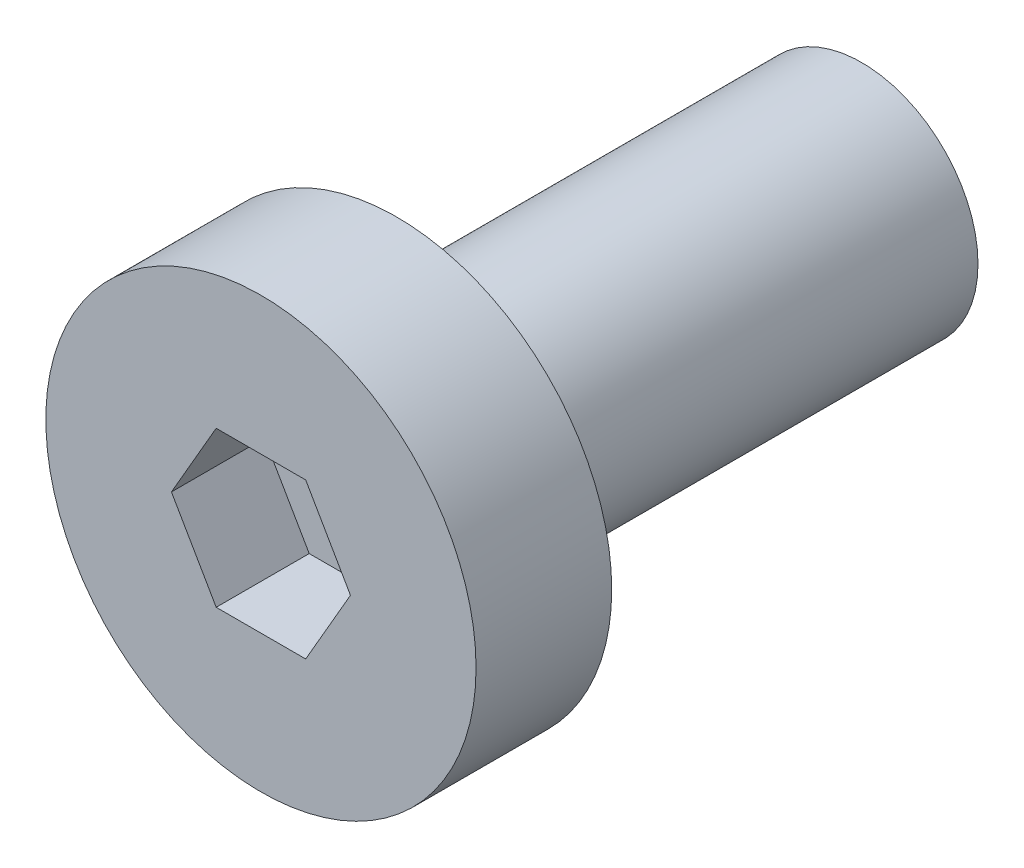
ISO-10303-21;
HEADER;
FILE_DESCRIPTION(('STEP AP214'),'2;1');
FILE_NAME('part.step','',(''),(''),'','','');
FILE_SCHEMA(('AUTOMOTIVE_DESIGN { 1 0 10303 214 1 1 1 1 }'));
ENDSEC;
DATA;
#1=APPLICATION_CONTEXT('core data for automotive mechanical design processes');
#2=APPLICATION_PROTOCOL_DEFINITION('international standard','automotive_design',2000,#1);
#3=PRODUCT_CONTEXT('',#1,'mechanical');
#4=PRODUCT('Part','Part','',(#3));
#5=PRODUCT_RELATED_PRODUCT_CATEGORY('part','',(#4));
#6=PRODUCT_DEFINITION_FORMATION('','',#4);
#7=PRODUCT_DEFINITION_CONTEXT('part definition',#1,'design');
#8=PRODUCT_DEFINITION('design','',#6,#7);
#9=PRODUCT_DEFINITION_SHAPE('','',#8);
#10=(LENGTH_UNIT() NAMED_UNIT(*) SI_UNIT(.MILLI.,.METRE.));
#11=(NAMED_UNIT(*) PLANE_ANGLE_UNIT() SI_UNIT($,.RADIAN.));
#12=(NAMED_UNIT(*) SI_UNIT($,.STERADIAN.) SOLID_ANGLE_UNIT());
#13=UNCERTAINTY_MEASURE_WITH_UNIT(LENGTH_MEASURE(1.E-05),#10,'distance_accuracy_value','');
#14=(GEOMETRIC_REPRESENTATION_CONTEXT(3) GLOBAL_UNCERTAINTY_ASSIGNED_CONTEXT((#13)) GLOBAL_UNIT_ASSIGNED_CONTEXT((#10,
#11,#12)) REPRESENTATION_CONTEXT('',''));
#15=CARTESIAN_POINT('',(0.,0.,0.));
#16=DIRECTION('',(0.,0.,1.));
#17=DIRECTION('',(1.,0.,0.));
#18=AXIS2_PLACEMENT_3D('',#15,#16,#17);
#19=CARTESIAN_POINT('',(0.,0.,1.75));
#20=DIRECTION('',(0.,0.,-1.));
#21=DIRECTION('',(-1.,0.,0.));
#22=AXIS2_PLACEMENT_3D('',#19,#20,#21);
#23=CYLINDRICAL_SURFACE('',#22,2.775);
#24=CARTESIAN_POINT('',(0.,0.,1.75));
#25=DIRECTION('',(0.,0.,1.));
#26=DIRECTION('',(1.,0.,0.));
#27=AXIS2_PLACEMENT_3D('',#24,#25,#26);
#28=CIRCLE('',#27,2.775);
#29=CARTESIAN_POINT('',(2.775,0.,1.75));
#30=VERTEX_POINT('',#29);
#31=EDGE_CURVE('E48',#30,#30,#28,.T.);
#32=ORIENTED_EDGE('',*,*,#31,.F.);
#33=EDGE_LOOP('',(#32));
#34=FACE_BOUND('',#33,.T.);
#35=CARTESIAN_POINT('',(0.,0.,0.));
#36=DIRECTION('',(0.,0.,1.));
#37=DIRECTION('',(1.,0.,0.));
#38=AXIS2_PLACEMENT_3D('',#35,#36,#37);
#39=CIRCLE('',#38,2.775);
#40=CARTESIAN_POINT('',(2.775,0.,0.));
#41=VERTEX_POINT('',#40);
#42=EDGE_CURVE('E42',#41,#41,#39,.T.);
#43=ORIENTED_EDGE('',*,*,#42,.T.);
#44=EDGE_LOOP('',(#43));
#45=FACE_BOUND('',#44,.T.);
#46=ADVANCED_FACE('F39',(#34,#45),#23,.T.);
#47=CARTESIAN_POINT('',(0.,0.,1.75));
#48=DIRECTION('',(0.,0.,1.));
#49=DIRECTION('',(1.,0.,0.));
#50=AXIS2_PLACEMENT_3D('',#47,#48,#49);
#51=PLANE('',#50);
#52=DIRECTION('',(0.5,0.866025403784439,0.));
#53=VECTOR('',#52,1.);
#54=CARTESIAN_POINT('',(0.577350269189626,-1.,1.75));
#55=LINE('',#54,#53);
#56=CARTESIAN_POINT('',(0.577350269189626,-1.,1.75));
#57=VERTEX_POINT('',#56);
#58=CARTESIAN_POINT('',(1.15470053837925,0.,1.75));
#59=VERTEX_POINT('',#58);
#60=EDGE_CURVE('E59',#57,#59,#55,.T.);
#61=ORIENTED_EDGE('',*,*,#60,.F.);
#62=DIRECTION('',(1.,0.,0.));
#63=VECTOR('',#62,1.);
#64=CARTESIAN_POINT('',(-0.577350269189626,-1.,1.75));
#65=LINE('',#64,#63);
#66=CARTESIAN_POINT('',(-0.577350269189626,-1.,1.75));
#67=VERTEX_POINT('',#66);
#68=EDGE_CURVE('E162',#67,#57,#65,.T.);
#69=ORIENTED_EDGE('',*,*,#68,.F.);
#70=DIRECTION('',(0.5,-0.866025403784439,0.));
#71=VECTOR('',#70,1.);
#72=CARTESIAN_POINT('',(-1.15470053837925,0.,1.75));
#73=LINE('',#72,#71);
#74=CARTESIAN_POINT('',(-1.15470053837925,0.,1.75));
#75=VERTEX_POINT('',#74);
#76=EDGE_CURVE('E159',#75,#67,#73,.T.);
#77=ORIENTED_EDGE('',*,*,#76,.F.);
#78=DIRECTION('',(-0.5,-0.866025403784439,0.));
#79=VECTOR('',#78,1.);
#80=CARTESIAN_POINT('',(-0.577350269189626,1.,1.75));
#81=LINE('',#80,#79);
#82=CARTESIAN_POINT('',(-0.577350269189626,1.,1.75));
#83=VERTEX_POINT('',#82);
#84=EDGE_CURVE('E116',#83,#75,#81,.T.);
#85=ORIENTED_EDGE('',*,*,#84,.F.);
#86=DIRECTION('',(-1.,0.,0.));
#87=VECTOR('',#86,1.);
#88=CARTESIAN_POINT('',(0.577350269189626,1.,1.75));
#89=LINE('',#88,#87);
#90=CARTESIAN_POINT('',(0.577350269189626,1.,1.75));
#91=VERTEX_POINT('',#90);
#92=EDGE_CURVE('E153',#91,#83,#89,.T.);
#93=ORIENTED_EDGE('',*,*,#92,.F.);
#94=DIRECTION('',(-0.5,0.866025403784438,0.));
#95=VECTOR('',#94,1.);
#96=CARTESIAN_POINT('',(1.15470053837925,0.,1.75));
#97=LINE('',#96,#95);
#98=EDGE_CURVE('E149',#59,#91,#97,.T.);
#99=ORIENTED_EDGE('',*,*,#98,.F.);
#100=EDGE_LOOP('',(#61,#69,#77,#85,#93,#99));
#101=FACE_BOUND('',#100,.T.);
#102=ORIENTED_EDGE('',*,*,#31,.T.);
#103=EDGE_LOOP('',(#102));
#104=FACE_BOUND('',#103,.T.);
#105=ADVANCED_FACE('F191',(#101,#104),#51,.T.);
#106=CARTESIAN_POINT('',(0.,0.,0.));
#107=DIRECTION('',(0.,0.,1.));
#108=DIRECTION('',(1.,0.,0.));
#109=AXIS2_PLACEMENT_3D('',#106,#107,#108);
#110=PLANE('',#109);
#111=CARTESIAN_POINT('',(0.,0.,0.));
#112=DIRECTION('',(0.,0.,-1.));
#113=DIRECTION('',(-1.,0.,0.));
#114=AXIS2_PLACEMENT_3D('',#111,#112,#113);
#115=CIRCLE('',#114,1.5);
#116=CARTESIAN_POINT('',(-1.5,0.,0.));
#117=VERTEX_POINT('',#116);
#118=EDGE_CURVE('E11',#117,#117,#115,.T.);
#119=ORIENTED_EDGE('',*,*,#118,.F.);
#120=EDGE_LOOP('',(#119));
#121=FACE_BOUND('',#120,.T.);
#122=ORIENTED_EDGE('',*,*,#42,.F.);
#123=EDGE_LOOP('',(#122));
#124=FACE_BOUND('',#123,.T.);
#125=ADVANCED_FACE('F188',(#121,#124),#110,.F.);
#126=CARTESIAN_POINT('',(0.,0.,-6.));
#127=DIRECTION('',(0.,0.,1.));
#128=DIRECTION('',(1.,0.,0.));
#129=AXIS2_PLACEMENT_3D('',#126,#127,#128);
#130=CYLINDRICAL_SURFACE('',#129,1.5);
#131=CARTESIAN_POINT('',(0.,0.,-6.));
#132=DIRECTION('',(0.,0.,-1.));
#133=DIRECTION('',(-1.,0.,0.));
#134=AXIS2_PLACEMENT_3D('',#131,#132,#133);
#135=CIRCLE('',#134,1.5);
#136=CARTESIAN_POINT('',(-1.5,0.,-6.));
#137=VERTEX_POINT('',#136);
#138=EDGE_CURVE('E168',#137,#137,#135,.T.);
#139=ORIENTED_EDGE('',*,*,#138,.F.);
#140=EDGE_LOOP('',(#139));
#141=FACE_BOUND('',#140,.T.);
#142=ORIENTED_EDGE('',*,*,#118,.T.);
#143=EDGE_LOOP('',(#142));
#144=FACE_BOUND('',#143,.T.);
#145=ADVANCED_FACE('F190',(#141,#144),#130,.T.);
#146=CARTESIAN_POINT('',(0.,0.,-6.));
#147=DIRECTION('',(0.,0.,-1.));
#148=DIRECTION('',(-1.,0.,0.));
#149=AXIS2_PLACEMENT_3D('',#146,#147,#148);
#150=PLANE('',#149);
#151=ORIENTED_EDGE('',*,*,#138,.T.);
#152=EDGE_LOOP('',(#151));
#153=FACE_BOUND('',#152,.T.);
#154=ADVANCED_FACE('F197',(#153),#150,.T.);
#155=CARTESIAN_POINT('',(0.577350269189626,-1.,0.55));
#156=DIRECTION('',(0.866025403784439,-0.5,0.));
#157=DIRECTION('',(0.5,0.866025403784439,0.));
#158=AXIS2_PLACEMENT_3D('',#155,#156,#157);
#159=PLANE('',#158);
#160=ORIENTED_EDGE('',*,*,#60,.T.);
#161=DIRECTION('',(0.,0.,1.));
#162=VECTOR('',#161,1.);
#163=CARTESIAN_POINT('',(1.15470053837925,0.,0.55));
#164=LINE('',#163,#162);
#165=CARTESIAN_POINT('',(1.15470053837925,0.,0.55));
#166=VERTEX_POINT('',#165);
#167=EDGE_CURVE('E97',#166,#59,#164,.T.);
#168=ORIENTED_EDGE('',*,*,#167,.F.);
#169=DIRECTION('',(0.5,0.866025403784439,0.));
#170=VECTOR('',#169,1.);
#171=CARTESIAN_POINT('',(0.577350269189626,-1.,0.55));
#172=LINE('',#171,#170);
#173=CARTESIAN_POINT('',(0.577350269189626,-1.,0.55));
#174=VERTEX_POINT('',#173);
#175=EDGE_CURVE('E165',#174,#166,#172,.T.);
#176=ORIENTED_EDGE('',*,*,#175,.F.);
#177=DIRECTION('',(0.,0.,1.));
#178=VECTOR('',#177,1.);
#179=CARTESIAN_POINT('',(0.577350269189626,-1.,0.55));
#180=LINE('',#179,#178);
#181=EDGE_CURVE('E70',#174,#57,#180,.T.);
#182=ORIENTED_EDGE('',*,*,#181,.T.);
#183=EDGE_LOOP('',(#160,#168,#176,#182));
#184=FACE_BOUND('',#183,.T.);
#185=ADVANCED_FACE('F230',(#184),#159,.F.);
#186=CARTESIAN_POINT('',(-0.577350269189626,-1.,0.55));
#187=DIRECTION('',(0.,-1.,0.));
#188=DIRECTION('',(0.,0.,-1.));
#189=AXIS2_PLACEMENT_3D('',#186,#187,#188);
#190=PLANE('',#189);
#191=ORIENTED_EDGE('',*,*,#68,.T.);
#192=ORIENTED_EDGE('',*,*,#181,.F.);
#193=DIRECTION('',(1.,0.,0.));
#194=VECTOR('',#193,1.);
#195=CARTESIAN_POINT('',(-0.577350269189626,-1.,0.55));
#196=LINE('',#195,#194);
#197=CARTESIAN_POINT('',(-0.577350269189626,-1.,0.55));
#198=VERTEX_POINT('',#197);
#199=EDGE_CURVE('E130',#198,#174,#196,.T.);
#200=ORIENTED_EDGE('',*,*,#199,.F.);
#201=DIRECTION('',(0.,0.,1.));
#202=VECTOR('',#201,1.);
#203=CARTESIAN_POINT('',(-0.577350269189626,-1.,0.55));
#204=LINE('',#203,#202);
#205=EDGE_CURVE('E121',#198,#67,#204,.T.);
#206=ORIENTED_EDGE('',*,*,#205,.T.);
#207=EDGE_LOOP('',(#191,#192,#200,#206));
#208=FACE_BOUND('',#207,.T.);
#209=ADVANCED_FACE('F240',(#208),#190,.F.);
#210=CARTESIAN_POINT('',(-1.15470053837925,0.,0.55));
#211=DIRECTION('',(-0.866025403784439,-0.5,0.));
#212=DIRECTION('',(0.5,-0.866025403784439,0.));
#213=AXIS2_PLACEMENT_3D('',#210,#211,#212);
#214=PLANE('',#213);
#215=ORIENTED_EDGE('',*,*,#76,.T.);
#216=ORIENTED_EDGE('',*,*,#205,.F.);
#217=DIRECTION('',(0.5,-0.866025403784439,0.));
#218=VECTOR('',#217,1.);
#219=CARTESIAN_POINT('',(-1.15470053837925,0.,0.55));
#220=LINE('',#219,#218);
#221=CARTESIAN_POINT('',(-1.15470053837925,0.,0.55));
#222=VERTEX_POINT('',#221);
#223=EDGE_CURVE('E125',#222,#198,#220,.T.);
#224=ORIENTED_EDGE('',*,*,#223,.F.);
#225=DIRECTION('',(0.,0.,1.));
#226=VECTOR('',#225,1.);
#227=CARTESIAN_POINT('',(-1.15470053837925,0.,0.55));
#228=LINE('',#227,#226);
#229=EDGE_CURVE('E109',#222,#75,#228,.T.);
#230=ORIENTED_EDGE('',*,*,#229,.T.);
#231=EDGE_LOOP('',(#215,#216,#224,#230));
#232=FACE_BOUND('',#231,.T.);
#233=ADVANCED_FACE('F126',(#232),#214,.F.);
#234=CARTESIAN_POINT('',(-0.577350269189626,1.,0.55));
#235=DIRECTION('',(-0.866025403784439,0.5,0.));
#236=DIRECTION('',(-0.5,-0.866025403784439,0.));
#237=AXIS2_PLACEMENT_3D('',#234,#235,#236);
#238=PLANE('',#237);
#239=ORIENTED_EDGE('',*,*,#84,.T.);
#240=ORIENTED_EDGE('',*,*,#229,.F.);
#241=DIRECTION('',(-0.5,-0.866025403784439,0.));
#242=VECTOR('',#241,1.);
#243=CARTESIAN_POINT('',(-0.577350269189626,1.,0.55));
#244=LINE('',#243,#242);
#245=CARTESIAN_POINT('',(-0.577350269189626,1.,0.55));
#246=VERTEX_POINT('',#245);
#247=EDGE_CURVE('E113',#246,#222,#244,.T.);
#248=ORIENTED_EDGE('',*,*,#247,.F.);
#249=DIRECTION('',(0.,0.,1.));
#250=VECTOR('',#249,1.);
#251=CARTESIAN_POINT('',(-0.577350269189626,1.,0.55));
#252=LINE('',#251,#250);
#253=EDGE_CURVE('E122',#246,#83,#252,.T.);
#254=ORIENTED_EDGE('',*,*,#253,.T.);
#255=EDGE_LOOP('',(#239,#240,#248,#254));
#256=FACE_BOUND('',#255,.T.);
#257=ADVANCED_FACE('F111',(#256),#238,.F.);
#258=CARTESIAN_POINT('',(0.577350269189626,1.,0.55));
#259=DIRECTION('',(0.,1.,0.));
#260=DIRECTION('',(0.,0.,1.));
#261=AXIS2_PLACEMENT_3D('',#258,#259,#260);
#262=PLANE('',#261);
#263=ORIENTED_EDGE('',*,*,#92,.T.);
#264=ORIENTED_EDGE('',*,*,#253,.F.);
#265=DIRECTION('',(-1.,0.,0.));
#266=VECTOR('',#265,1.);
#267=CARTESIAN_POINT('',(0.577350269189626,1.,0.55));
#268=LINE('',#267,#266);
#269=CARTESIAN_POINT('',(0.577350269189626,1.,0.55));
#270=VERTEX_POINT('',#269);
#271=EDGE_CURVE('E136',#270,#246,#268,.T.);
#272=ORIENTED_EDGE('',*,*,#271,.F.);
#273=DIRECTION('',(0.,0.,1.));
#274=VECTOR('',#273,1.);
#275=CARTESIAN_POINT('',(0.577350269189626,1.,0.55));
#276=LINE('',#275,#274);
#277=EDGE_CURVE('E172',#270,#91,#276,.T.);
#278=ORIENTED_EDGE('',*,*,#277,.T.);
#279=EDGE_LOOP('',(#263,#264,#272,#278));
#280=FACE_BOUND('',#279,.T.);
#281=ADVANCED_FACE('F258',(#280),#262,.F.);
#282=CARTESIAN_POINT('',(1.15470053837925,0.,0.55));
#283=DIRECTION('',(0.866025403784439,0.5,0.));
#284=DIRECTION('',(-0.5,0.866025403784439,0.));
#285=AXIS2_PLACEMENT_3D('',#282,#283,#284);
#286=PLANE('',#285);
#287=ORIENTED_EDGE('',*,*,#98,.T.);
#288=ORIENTED_EDGE('',*,*,#277,.F.);
#289=DIRECTION('',(-0.5,0.866025403784438,0.));
#290=VECTOR('',#289,1.);
#291=CARTESIAN_POINT('',(1.15470053837925,0.,0.55));
#292=LINE('',#291,#290);
#293=EDGE_CURVE('E141',#166,#270,#292,.T.);
#294=ORIENTED_EDGE('',*,*,#293,.F.);
#295=ORIENTED_EDGE('',*,*,#167,.T.);
#296=EDGE_LOOP('',(#287,#288,#294,#295));
#297=FACE_BOUND('',#296,.T.);
#298=ADVANCED_FACE('F265',(#297),#286,.F.);
#299=CARTESIAN_POINT('',(0.,0.,0.55));
#300=DIRECTION('',(0.,0.,1.));
#301=DIRECTION('',(1.,0.,0.));
#302=AXIS2_PLACEMENT_3D('',#299,#300,#301);
#303=PLANE('',#302);
#304=ORIENTED_EDGE('',*,*,#175,.T.);
#305=ORIENTED_EDGE('',*,*,#293,.T.);
#306=ORIENTED_EDGE('',*,*,#271,.T.);
#307=ORIENTED_EDGE('',*,*,#247,.T.);
#308=ORIENTED_EDGE('',*,*,#223,.T.);
#309=ORIENTED_EDGE('',*,*,#199,.T.);
#310=EDGE_LOOP('',(#304,#305,#306,#307,#308,#309));
#311=FACE_BOUND('',#310,.T.);
#312=ADVANCED_FACE('F133',(#311),#303,.T.);
#313=CLOSED_SHELL('',(#46,#105,#125,#145,#154,#185,#209,#233,#257,#281,#298,#312));
#314=MANIFOLD_SOLID_BREP('B2',#313);
#315=ADVANCED_BREP_SHAPE_REPRESENTATION('',(#18,#314),#14);
#316=SHAPE_DEFINITION_REPRESENTATION(#9,#315);
ENDSEC;
END-ISO-10303-21;
